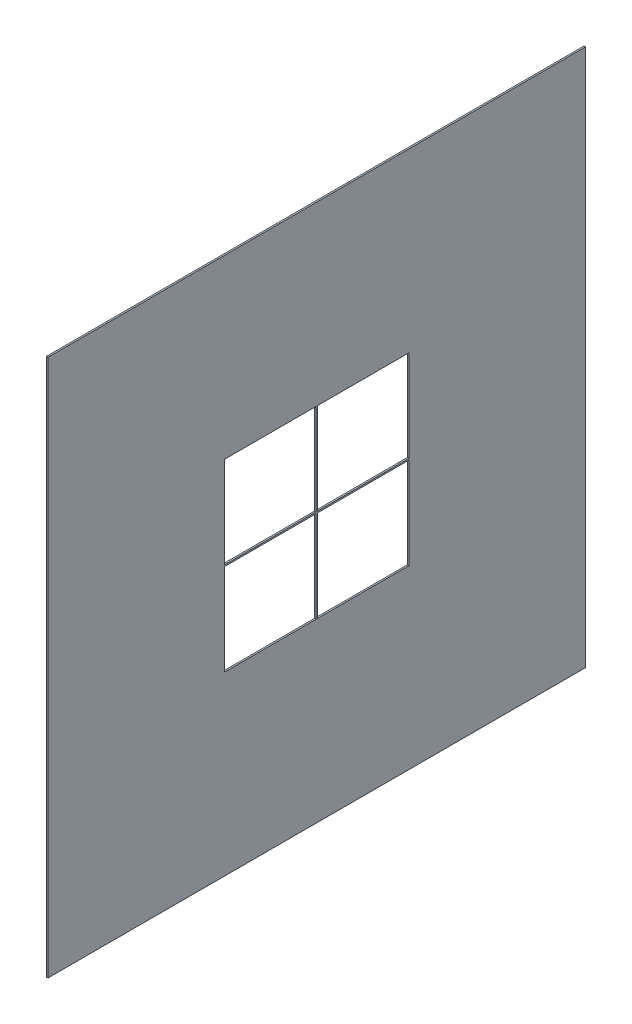
ISO-10303-21;
HEADER;
FILE_DESCRIPTION(('STEP AP214'),'2;1');
FILE_NAME('part.step','',(''),(''),'','','');
FILE_SCHEMA(('AUTOMOTIVE_DESIGN { 1 0 10303 214 1 1 1 1 }'));
ENDSEC;
DATA;
#1=APPLICATION_CONTEXT('core data for automotive mechanical design processes');
#2=APPLICATION_PROTOCOL_DEFINITION('international standard','automotive_design',2000,#1);
#3=PRODUCT_CONTEXT('',#1,'mechanical');
#4=PRODUCT('Part','Part','',(#3));
#5=PRODUCT_RELATED_PRODUCT_CATEGORY('part','',(#4));
#6=PRODUCT_DEFINITION_FORMATION('','',#4);
#7=PRODUCT_DEFINITION_CONTEXT('part definition',#1,'design');
#8=PRODUCT_DEFINITION('design','',#6,#7);
#9=PRODUCT_DEFINITION_SHAPE('','',#8);
#10=(LENGTH_UNIT() NAMED_UNIT(*) SI_UNIT(.MILLI.,.METRE.));
#11=(NAMED_UNIT(*) PLANE_ANGLE_UNIT() SI_UNIT($,.RADIAN.));
#12=(NAMED_UNIT(*) SI_UNIT($,.STERADIAN.) SOLID_ANGLE_UNIT());
#13=UNCERTAINTY_MEASURE_WITH_UNIT(LENGTH_MEASURE(1.E-05),#10,'distance_accuracy_value','');
#14=(GEOMETRIC_REPRESENTATION_CONTEXT(3) GLOBAL_UNCERTAINTY_ASSIGNED_CONTEXT((#13)) GLOBAL_UNIT_ASSIGNED_CONTEXT((#10,
#11,#12)) REPRESENTATION_CONTEXT('',''));
#15=CARTESIAN_POINT('',(0.,0.,0.));
#16=DIRECTION('',(0.,0.,1.));
#17=DIRECTION('',(1.,0.,0.));
#18=AXIS2_PLACEMENT_3D('',#15,#16,#17);
#19=CARTESIAN_POINT('',(10.,-1750.,-1750.));
#20=DIRECTION('',(0.,0.,1.));
#21=DIRECTION('',(1.,0.,0.));
#22=AXIS2_PLACEMENT_3D('',#19,#20,#21);
#23=PLANE('',#22);
#24=DIRECTION('',(0.,1.,0.));
#25=VECTOR('',#24,1.);
#26=CARTESIAN_POINT('',(0.,-1750.,-1750.));
#27=LINE('',#26,#25);
#28=CARTESIAN_POINT('',(0.,-1750.,-1750.));
#29=VERTEX_POINT('',#28);
#30=CARTESIAN_POINT('',(0.,1750.,-1750.));
#31=VERTEX_POINT('',#30);
#32=EDGE_CURVE('E300',#29,#31,#27,.T.);
#33=ORIENTED_EDGE('',*,*,#32,.T.);
#34=DIRECTION('',(-1.,0.,0.));
#35=VECTOR('',#34,1.);
#36=CARTESIAN_POINT('',(10.,1750.,-1750.));
#37=LINE('',#36,#35);
#38=CARTESIAN_POINT('',(10.,1750.,-1750.));
#39=VERTEX_POINT('',#38);
#40=EDGE_CURVE('E11',#39,#31,#37,.T.);
#41=ORIENTED_EDGE('',*,*,#40,.F.);
#42=DIRECTION('',(0.,1.,0.));
#43=VECTOR('',#42,1.);
#44=CARTESIAN_POINT('',(10.,-1750.,-1750.));
#45=LINE('',#44,#43);
#46=CARTESIAN_POINT('',(10.,-1750.,-1750.));
#47=VERTEX_POINT('',#46);
#48=EDGE_CURVE('E307',#47,#39,#45,.T.);
#49=ORIENTED_EDGE('',*,*,#48,.F.);
#50=DIRECTION('',(-1.,0.,0.));
#51=VECTOR('',#50,1.);
#52=CARTESIAN_POINT('',(10.,-1750.,-1750.));
#53=LINE('',#52,#51);
#54=EDGE_CURVE('E317',#47,#29,#53,.T.);
#55=ORIENTED_EDGE('',*,*,#54,.T.);
#56=EDGE_LOOP('',(#33,#41,#49,#55));
#57=FACE_BOUND('',#56,.T.);
#58=ADVANCED_FACE('F35',(#57),#23,.F.);
#59=CARTESIAN_POINT('',(10.,1750.,1750.));
#60=DIRECTION('',(0.,-1.,0.));
#61=DIRECTION('',(0.,0.,-1.));
#62=AXIS2_PLACEMENT_3D('',#59,#60,#61);
#63=PLANE('',#62);
#64=DIRECTION('',(0.,0.,1.));
#65=VECTOR('',#64,1.);
#66=CARTESIAN_POINT('',(0.,1750.,1750.));
#67=LINE('',#66,#65);
#68=CARTESIAN_POINT('',(0.,1750.,1750.));
#69=VERTEX_POINT('',#68);
#70=EDGE_CURVE('E320',#31,#69,#67,.T.);
#71=ORIENTED_EDGE('',*,*,#70,.T.);
#72=DIRECTION('',(-1.,0.,0.));
#73=VECTOR('',#72,1.);
#74=CARTESIAN_POINT('',(10.,1750.,1750.));
#75=LINE('',#74,#73);
#76=CARTESIAN_POINT('',(10.,1750.,1750.));
#77=VERTEX_POINT('',#76);
#78=EDGE_CURVE('E42',#77,#69,#75,.T.);
#79=ORIENTED_EDGE('',*,*,#78,.F.);
#80=DIRECTION('',(0.,0.,1.));
#81=VECTOR('',#80,1.);
#82=CARTESIAN_POINT('',(10.,1750.,1750.));
#83=LINE('',#82,#81);
#84=EDGE_CURVE('E310',#39,#77,#83,.T.);
#85=ORIENTED_EDGE('',*,*,#84,.F.);
#86=ORIENTED_EDGE('',*,*,#40,.T.);
#87=EDGE_LOOP('',(#71,#79,#85,#86));
#88=FACE_BOUND('',#87,.T.);
#89=ADVANCED_FACE('F349',(#88),#63,.F.);
#90=CARTESIAN_POINT('',(10.,-1750.,1750.));
#91=DIRECTION('',(0.,0.,-1.));
#92=DIRECTION('',(-1.,0.,0.));
#93=AXIS2_PLACEMENT_3D('',#90,#91,#92);
#94=PLANE('',#93);
#95=DIRECTION('',(0.,-1.,0.));
#96=VECTOR('',#95,1.);
#97=CARTESIAN_POINT('',(0.,-1750.,1750.));
#98=LINE('',#97,#96);
#99=CARTESIAN_POINT('',(0.,-1750.,1750.));
#100=VERTEX_POINT('',#99);
#101=EDGE_CURVE('E322',#69,#100,#98,.T.);
#102=ORIENTED_EDGE('',*,*,#101,.T.);
#103=DIRECTION('',(-1.,0.,0.));
#104=VECTOR('',#103,1.);
#105=CARTESIAN_POINT('',(10.,-1750.,1750.));
#106=LINE('',#105,#104);
#107=CARTESIAN_POINT('',(10.,-1750.,1750.));
#108=VERTEX_POINT('',#107);
#109=EDGE_CURVE('E327',#108,#100,#106,.T.);
#110=ORIENTED_EDGE('',*,*,#109,.F.);
#111=DIRECTION('',(0.,-1.,0.));
#112=VECTOR('',#111,1.);
#113=CARTESIAN_POINT('',(10.,-1750.,1750.));
#114=LINE('',#113,#112);
#115=EDGE_CURVE('E313',#77,#108,#114,.T.);
#116=ORIENTED_EDGE('',*,*,#115,.F.);
#117=ORIENTED_EDGE('',*,*,#78,.T.);
#118=EDGE_LOOP('',(#102,#110,#116,#117));
#119=FACE_BOUND('',#118,.T.);
#120=ADVANCED_FACE('F334',(#119),#94,.F.);
#121=CARTESIAN_POINT('',(10.,-1750.,1750.));
#122=DIRECTION('',(0.,1.,0.));
#123=DIRECTION('',(0.,0.,1.));
#124=AXIS2_PLACEMENT_3D('',#121,#122,#123);
#125=PLANE('',#124);
#126=DIRECTION('',(0.,0.,-1.));
#127=VECTOR('',#126,1.);
#128=CARTESIAN_POINT('',(0.,-1750.,1750.));
#129=LINE('',#128,#127);
#130=EDGE_CURVE('E311',#100,#29,#129,.T.);
#131=ORIENTED_EDGE('',*,*,#130,.T.);
#132=ORIENTED_EDGE('',*,*,#54,.F.);
#133=DIRECTION('',(0.,0.,-1.));
#134=VECTOR('',#133,1.);
#135=CARTESIAN_POINT('',(10.,-1750.,1750.));
#136=LINE('',#135,#134);
#137=EDGE_CURVE('E315',#108,#47,#136,.T.);
#138=ORIENTED_EDGE('',*,*,#137,.F.);
#139=ORIENTED_EDGE('',*,*,#109,.T.);
#140=EDGE_LOOP('',(#131,#132,#138,#139));
#141=FACE_BOUND('',#140,.T.);
#142=ADVANCED_FACE('F342',(#141),#125,.F.);
#143=CARTESIAN_POINT('',(10.,0.,0.));
#144=DIRECTION('',(-1.,0.,0.));
#145=DIRECTION('',(0.,0.,1.));
#146=AXIS2_PLACEMENT_3D('',#143,#144,#145);
#147=PLANE('',#146);
#148=DIRECTION('',(0.,1.,0.));
#149=VECTOR('',#148,1.);
#150=CARTESIAN_POINT('',(10.,-600.,-600.));
#151=LINE('',#150,#149);
#152=CARTESIAN_POINT('',(10.,-600.,-600.));
#153=VERTEX_POINT('',#152);
#154=CARTESIAN_POINT('',(10.,-4.99999999999999,-600.000000000001));
#155=VERTEX_POINT('',#154);
#156=EDGE_CURVE('E261',#153,#155,#151,.T.);
#157=ORIENTED_EDGE('',*,*,#156,.F.);
#158=DIRECTION('',(0.,0.,-1.));
#159=VECTOR('',#158,1.);
#160=CARTESIAN_POINT('',(10.,-600.,-5.00000000000014));
#161=LINE('',#160,#159);
#162=CARTESIAN_POINT('',(10.,-600.,-5.00000000000014));
#163=VERTEX_POINT('',#162);
#164=EDGE_CURVE('E49',#163,#153,#161,.T.);
#165=ORIENTED_EDGE('',*,*,#164,.F.);
#166=DIRECTION('',(0.,-1.,0.));
#167=VECTOR('',#166,1.);
#168=CARTESIAN_POINT('',(10.,-4.99999999999977,-5.00000000000006));
#169=LINE('',#168,#167);
#170=CARTESIAN_POINT('',(10.,-4.99999999999977,-5.00000000000006));
#171=VERTEX_POINT('',#170);
#172=EDGE_CURVE('E250',#171,#163,#169,.T.);
#173=ORIENTED_EDGE('',*,*,#172,.F.);
#174=DIRECTION('',(0.,0.,1.));
#175=VECTOR('',#174,1.);
#176=CARTESIAN_POINT('',(10.,-4.99999999999977,-5.00000000000006));
#177=LINE('',#176,#175);
#178=EDGE_CURVE('E264',#155,#171,#177,.T.);
#179=ORIENTED_EDGE('',*,*,#178,.F.);
#180=EDGE_LOOP('',(#157,#165,#173,#179));
#181=FACE_BOUND('',#180,.T.);
#182=DIRECTION('',(0.,0.,-1.));
#183=VECTOR('',#182,1.);
#184=CARTESIAN_POINT('',(10.,5.00000000000001,599.999999999999));
#185=LINE('',#184,#183);
#186=CARTESIAN_POINT('',(10.,5.00000000000001,599.999999999999));
#187=VERTEX_POINT('',#186);
#188=CARTESIAN_POINT('',(10.,5.00000000000024,5.));
#189=VERTEX_POINT('',#188);
#190=EDGE_CURVE('E231',#187,#189,#185,.T.);
#191=ORIENTED_EDGE('',*,*,#190,.F.);
#192=DIRECTION('',(0.,-1.,0.));
#193=VECTOR('',#192,1.);
#194=CARTESIAN_POINT('',(10.,5.00000000000001,599.999999999999));
#195=LINE('',#194,#193);
#196=CARTESIAN_POINT('',(10.,600.,600.));
#197=VERTEX_POINT('',#196);
#198=EDGE_CURVE('E57',#197,#187,#195,.T.);
#199=ORIENTED_EDGE('',*,*,#198,.F.);
#200=DIRECTION('',(0.,0.,1.));
#201=VECTOR('',#200,1.);
#202=CARTESIAN_POINT('',(10.,600.,600.));
#203=LINE('',#202,#201);
#204=CARTESIAN_POINT('',(10.,600.,4.99999999997974));
#205=VERTEX_POINT('',#204);
#206=EDGE_CURVE('E220',#205,#197,#203,.T.);
#207=ORIENTED_EDGE('',*,*,#206,.F.);
#208=DIRECTION('',(0.,1.,0.));
#209=VECTOR('',#208,1.);
#210=CARTESIAN_POINT('',(10.,600.,4.99999999997974));
#211=LINE('',#210,#209);
#212=EDGE_CURVE('E235',#189,#205,#211,.T.);
#213=ORIENTED_EDGE('',*,*,#212,.F.);
#214=EDGE_LOOP('',(#191,#199,#207,#213));
#215=FACE_BOUND('',#214,.T.);
#216=DIRECTION('',(0.,0.,-1.));
#217=VECTOR('',#216,1.);
#218=CARTESIAN_POINT('',(10.,-600.,600.));
#219=LINE('',#218,#217);
#220=CARTESIAN_POINT('',(10.,-600.,600.));
#221=VERTEX_POINT('',#220);
#222=CARTESIAN_POINT('',(10.,-600.,5.00000000001971));
#223=VERTEX_POINT('',#222);
#224=EDGE_CURVE('E205',#221,#223,#219,.T.);
#225=ORIENTED_EDGE('',*,*,#224,.F.);
#226=DIRECTION('',(0.,-1.,0.));
#227=VECTOR('',#226,1.);
#228=CARTESIAN_POINT('',(10.,-600.,600.));
#229=LINE('',#228,#227);
#230=CARTESIAN_POINT('',(10.,-4.99999999999999,599.999999999999));
#231=VERTEX_POINT('',#230);
#232=EDGE_CURVE('E178',#231,#221,#229,.T.);
#233=ORIENTED_EDGE('',*,*,#232,.F.);
#234=DIRECTION('',(0.,0.,1.));
#235=VECTOR('',#234,1.);
#236=CARTESIAN_POINT('',(10.,-4.99999999999999,599.999999999999));
#237=LINE('',#236,#235);
#238=CARTESIAN_POINT('',(10.,-4.99999999999977,4.99999999999966));
#239=VERTEX_POINT('',#238);
#240=EDGE_CURVE('E196',#239,#231,#237,.T.);
#241=ORIENTED_EDGE('',*,*,#240,.F.);
#242=DIRECTION('',(0.,1.,0.));
#243=VECTOR('',#242,1.);
#244=CARTESIAN_POINT('',(10.,-4.99999999999977,4.99999999999966));
#245=LINE('',#244,#243);
#246=EDGE_CURVE('E199',#223,#239,#245,.T.);
#247=ORIENTED_EDGE('',*,*,#246,.F.);
#248=EDGE_LOOP('',(#225,#233,#241,#247));
#249=FACE_BOUND('',#248,.T.);
#250=DIRECTION('',(0.,0.,1.));
#251=VECTOR('',#250,1.);
#252=CARTESIAN_POINT('',(10.,600.,-4.99999999999999));
#253=LINE('',#252,#251);
#254=CARTESIAN_POINT('',(10.,600.,-600.));
#255=VERTEX_POINT('',#254);
#256=CARTESIAN_POINT('',(10.,600.,-4.99999999999999));
#257=VERTEX_POINT('',#256);
#258=EDGE_CURVE('E290',#255,#257,#253,.T.);
#259=ORIENTED_EDGE('',*,*,#258,.F.);
#260=DIRECTION('',(0.,1.,0.));
#261=VECTOR('',#260,1.);
#262=CARTESIAN_POINT('',(10.,5.00000000000001,-600.000000000001));
#263=LINE('',#262,#261);
#264=CARTESIAN_POINT('',(10.,5.00000000000001,-600.000000000001));
#265=VERTEX_POINT('',#264);
#266=EDGE_CURVE('E212',#265,#255,#263,.T.);
#267=ORIENTED_EDGE('',*,*,#266,.F.);
#268=DIRECTION('',(0.,0.,-1.));
#269=VECTOR('',#268,1.);
#270=CARTESIAN_POINT('',(10.,5.00000000000023,-5.00000000000006));
#271=LINE('',#270,#269);
#272=CARTESIAN_POINT('',(10.,5.00000000000023,-5.00000000000006));
#273=VERTEX_POINT('',#272);
#274=EDGE_CURVE('E279',#273,#265,#271,.T.);
#275=ORIENTED_EDGE('',*,*,#274,.F.);
#276=DIRECTION('',(0.,-1.,0.));
#277=VECTOR('',#276,1.);
#278=CARTESIAN_POINT('',(10.,600.,-4.99999999999999));
#279=LINE('',#278,#277);
#280=EDGE_CURVE('E293',#257,#273,#279,.T.);
#281=ORIENTED_EDGE('',*,*,#280,.F.);
#282=EDGE_LOOP('',(#259,#267,#275,#281));
#283=FACE_BOUND('',#282,.T.);
#284=ORIENTED_EDGE('',*,*,#48,.T.);
#285=ORIENTED_EDGE('',*,*,#84,.T.);
#286=ORIENTED_EDGE('',*,*,#115,.T.);
#287=ORIENTED_EDGE('',*,*,#137,.T.);
#288=EDGE_LOOP('',(#284,#285,#286,#287));
#289=FACE_BOUND('',#288,.T.);
#290=ADVANCED_FACE('F348',(#181,#215,#249,#283,#289),#147,.F.);
#291=CARTESIAN_POINT('',(0.,0.,0.));
#292=DIRECTION('',(-1.,0.,0.));
#293=DIRECTION('',(0.,0.,1.));
#294=AXIS2_PLACEMENT_3D('',#291,#292,#293);
#295=PLANE('',#294);
#296=DIRECTION('',(0.,0.,-1.));
#297=VECTOR('',#296,1.);
#298=CARTESIAN_POINT('',(0.,-600.,-5.00000000000014));
#299=LINE('',#298,#297);
#300=CARTESIAN_POINT('',(0.,-600.,-5.00000000000014));
#301=VERTEX_POINT('',#300);
#302=CARTESIAN_POINT('',(0.,-600.,-600.));
#303=VERTEX_POINT('',#302);
#304=EDGE_CURVE('E246',#301,#303,#299,.T.);
#305=ORIENTED_EDGE('',*,*,#304,.T.);
#306=DIRECTION('',(0.,1.,0.));
#307=VECTOR('',#306,1.);
#308=CARTESIAN_POINT('',(0.,-600.,-600.));
#309=LINE('',#308,#307);
#310=CARTESIAN_POINT('',(0.,-4.99999999999999,-600.000000000001));
#311=VERTEX_POINT('',#310);
#312=EDGE_CURVE('E249',#303,#311,#309,.T.);
#313=ORIENTED_EDGE('',*,*,#312,.T.);
#314=DIRECTION('',(0.,0.,1.));
#315=VECTOR('',#314,1.);
#316=CARTESIAN_POINT('',(0.,-4.99999999999977,-5.00000000000006));
#317=LINE('',#316,#315);
#318=CARTESIAN_POINT('',(0.,-4.99999999999977,-5.00000000000006));
#319=VERTEX_POINT('',#318);
#320=EDGE_CURVE('E253',#311,#319,#317,.T.);
#321=ORIENTED_EDGE('',*,*,#320,.T.);
#322=DIRECTION('',(0.,-1.,0.));
#323=VECTOR('',#322,1.);
#324=CARTESIAN_POINT('',(0.,-4.99999999999977,-5.00000000000006));
#325=LINE('',#324,#323);
#326=EDGE_CURVE('E256',#319,#301,#325,.T.);
#327=ORIENTED_EDGE('',*,*,#326,.T.);
#328=EDGE_LOOP('',(#305,#313,#321,#327));
#329=FACE_BOUND('',#328,.T.);
#330=DIRECTION('',(0.,-1.,0.));
#331=VECTOR('',#330,1.);
#332=CARTESIAN_POINT('',(0.,5.00000000000001,599.999999999999));
#333=LINE('',#332,#331);
#334=CARTESIAN_POINT('',(0.,600.,600.));
#335=VERTEX_POINT('',#334);
#336=CARTESIAN_POINT('',(0.,5.00000000000001,599.999999999999));
#337=VERTEX_POINT('',#336);
#338=EDGE_CURVE('E216',#335,#337,#333,.T.);
#339=ORIENTED_EDGE('',*,*,#338,.T.);
#340=DIRECTION('',(0.,0.,-1.));
#341=VECTOR('',#340,1.);
#342=CARTESIAN_POINT('',(0.,5.00000000000001,599.999999999999));
#343=LINE('',#342,#341);
#344=CARTESIAN_POINT('',(0.,5.00000000000024,5.));
#345=VERTEX_POINT('',#344);
#346=EDGE_CURVE('E219',#337,#345,#343,.T.);
#347=ORIENTED_EDGE('',*,*,#346,.T.);
#348=DIRECTION('',(0.,1.,0.));
#349=VECTOR('',#348,1.);
#350=CARTESIAN_POINT('',(0.,600.,4.99999999997974));
#351=LINE('',#350,#349);
#352=CARTESIAN_POINT('',(0.,600.,4.99999999997974));
#353=VERTEX_POINT('',#352);
#354=EDGE_CURVE('E223',#345,#353,#351,.T.);
#355=ORIENTED_EDGE('',*,*,#354,.T.);
#356=DIRECTION('',(0.,0.,1.));
#357=VECTOR('',#356,1.);
#358=CARTESIAN_POINT('',(0.,600.,600.));
#359=LINE('',#358,#357);
#360=EDGE_CURVE('E226',#353,#335,#359,.T.);
#361=ORIENTED_EDGE('',*,*,#360,.T.);
#362=EDGE_LOOP('',(#339,#347,#355,#361));
#363=FACE_BOUND('',#362,.T.);
#364=DIRECTION('',(0.,-1.,0.));
#365=VECTOR('',#364,1.);
#366=CARTESIAN_POINT('',(0.,-600.,600.));
#367=LINE('',#366,#365);
#368=CARTESIAN_POINT('',(0.,-4.99999999999999,599.999999999999));
#369=VERTEX_POINT('',#368);
#370=CARTESIAN_POINT('',(0.,-600.,600.));
#371=VERTEX_POINT('',#370);
#372=EDGE_CURVE('E175',#369,#371,#367,.T.);
#373=ORIENTED_EDGE('',*,*,#372,.T.);
#374=DIRECTION('',(0.,0.,-1.));
#375=VECTOR('',#374,1.);
#376=CARTESIAN_POINT('',(0.,-600.,600.));
#377=LINE('',#376,#375);
#378=CARTESIAN_POINT('',(0.,-600.,5.00000000001971));
#379=VERTEX_POINT('',#378);
#380=EDGE_CURVE('E187',#371,#379,#377,.T.);
#381=ORIENTED_EDGE('',*,*,#380,.T.);
#382=DIRECTION('',(0.,1.,0.));
#383=VECTOR('',#382,1.);
#384=CARTESIAN_POINT('',(0.,-4.99999999999977,4.99999999999966));
#385=LINE('',#384,#383);
#386=CARTESIAN_POINT('',(0.,-4.99999999999977,4.99999999999966));
#387=VERTEX_POINT('',#386);
#388=EDGE_CURVE('E191',#379,#387,#385,.T.);
#389=ORIENTED_EDGE('',*,*,#388,.T.);
#390=DIRECTION('',(0.,0.,1.));
#391=VECTOR('',#390,1.);
#392=CARTESIAN_POINT('',(0.,-4.99999999999999,599.999999999999));
#393=LINE('',#392,#391);
#394=EDGE_CURVE('E183',#387,#369,#393,.T.);
#395=ORIENTED_EDGE('',*,*,#394,.T.);
#396=EDGE_LOOP('',(#373,#381,#389,#395));
#397=FACE_BOUND('',#396,.T.);
#398=DIRECTION('',(0.,1.,0.));
#399=VECTOR('',#398,1.);
#400=CARTESIAN_POINT('',(0.,5.00000000000001,-600.000000000001));
#401=LINE('',#400,#399);
#402=CARTESIAN_POINT('',(0.,5.00000000000001,-600.000000000001));
#403=VERTEX_POINT('',#402);
#404=CARTESIAN_POINT('',(0.,600.,-600.));
#405=VERTEX_POINT('',#404);
#406=EDGE_CURVE('E275',#403,#405,#401,.T.);
#407=ORIENTED_EDGE('',*,*,#406,.T.);
#408=DIRECTION('',(0.,0.,1.));
#409=VECTOR('',#408,1.);
#410=CARTESIAN_POINT('',(0.,600.,-4.99999999999999));
#411=LINE('',#410,#409);
#412=CARTESIAN_POINT('',(0.,600.,-4.99999999999999));
#413=VERTEX_POINT('',#412);
#414=EDGE_CURVE('E278',#405,#413,#411,.T.);
#415=ORIENTED_EDGE('',*,*,#414,.T.);
#416=DIRECTION('',(0.,-1.,0.));
#417=VECTOR('',#416,1.);
#418=CARTESIAN_POINT('',(0.,600.,-4.99999999999999));
#419=LINE('',#418,#417);
#420=CARTESIAN_POINT('',(0.,5.00000000000023,-5.00000000000006));
#421=VERTEX_POINT('',#420);
#422=EDGE_CURVE('E282',#413,#421,#419,.T.);
#423=ORIENTED_EDGE('',*,*,#422,.T.);
#424=DIRECTION('',(0.,0.,-1.));
#425=VECTOR('',#424,1.);
#426=CARTESIAN_POINT('',(0.,5.00000000000023,-5.00000000000006));
#427=LINE('',#426,#425);
#428=EDGE_CURVE('E285',#421,#403,#427,.T.);
#429=ORIENTED_EDGE('',*,*,#428,.T.);
#430=EDGE_LOOP('',(#407,#415,#423,#429));
#431=FACE_BOUND('',#430,.T.);
#432=ORIENTED_EDGE('',*,*,#32,.F.);
#433=ORIENTED_EDGE('',*,*,#130,.F.);
#434=ORIENTED_EDGE('',*,*,#101,.F.);
#435=ORIENTED_EDGE('',*,*,#70,.F.);
#436=EDGE_LOOP('',(#432,#433,#434,#435));
#437=FACE_BOUND('',#436,.T.);
#438=ADVANCED_FACE('F193',(#329,#363,#397,#431,#437),#295,.T.);
#439=CARTESIAN_POINT('',(0.,5.00000000000001,-600.000000000001));
#440=DIRECTION('',(0.,0.,-1.));
#441=DIRECTION('',(0.,1.,0.));
#442=AXIS2_PLACEMENT_3D('',#439,#440,#441);
#443=PLANE('',#442);
#444=ORIENTED_EDGE('',*,*,#266,.T.);
#445=DIRECTION('',(1.,0.,0.));
#446=VECTOR('',#445,1.);
#447=CARTESIAN_POINT('',(0.,600.,-600.));
#448=LINE('',#447,#446);
#449=EDGE_CURVE('E288',#405,#255,#448,.T.);
#450=ORIENTED_EDGE('',*,*,#449,.F.);
#451=ORIENTED_EDGE('',*,*,#406,.F.);
#452=DIRECTION('',(1.,0.,0.));
#453=VECTOR('',#452,1.);
#454=CARTESIAN_POINT('',(0.,5.00000000000001,-600.000000000001));
#455=LINE('',#454,#453);
#456=EDGE_CURVE('E298',#403,#265,#455,.T.);
#457=ORIENTED_EDGE('',*,*,#456,.T.);
#458=EDGE_LOOP('',(#444,#450,#451,#457));
#459=FACE_BOUND('',#458,.T.);
#460=ADVANCED_FACE('F361',(#459),#443,.F.);
#461=CARTESIAN_POINT('',(0.,5.00000000000023,-5.00000000000006));
#462=DIRECTION('',(0.,-1.,0.));
#463=DIRECTION('',(0.,0.,-1.));
#464=AXIS2_PLACEMENT_3D('',#461,#462,#463);
#465=PLANE('',#464);
#466=ORIENTED_EDGE('',*,*,#274,.T.);
#467=ORIENTED_EDGE('',*,*,#456,.F.);
#468=ORIENTED_EDGE('',*,*,#428,.F.);
#469=DIRECTION('',(1.,0.,0.));
#470=VECTOR('',#469,1.);
#471=CARTESIAN_POINT('',(0.,5.00000000000023,-5.00000000000006));
#472=LINE('',#471,#470);
#473=EDGE_CURVE('E301',#421,#273,#472,.T.);
#474=ORIENTED_EDGE('',*,*,#473,.T.);
#475=EDGE_LOOP('',(#466,#467,#468,#474));
#476=FACE_BOUND('',#475,.T.);
#477=ADVANCED_FACE('F368',(#476),#465,.F.);
#478=CARTESIAN_POINT('',(0.,600.,-4.99999999999999));
#479=DIRECTION('',(0.,0.,1.));
#480=DIRECTION('',(0.,-1.,0.));
#481=AXIS2_PLACEMENT_3D('',#478,#479,#480);
#482=PLANE('',#481);
#483=ORIENTED_EDGE('',*,*,#280,.T.);
#484=ORIENTED_EDGE('',*,*,#473,.F.);
#485=ORIENTED_EDGE('',*,*,#422,.F.);
#486=DIRECTION('',(1.,0.,0.));
#487=VECTOR('',#486,1.);
#488=CARTESIAN_POINT('',(0.,600.,-4.99999999999999));
#489=LINE('',#488,#487);
#490=EDGE_CURVE('E303',#413,#257,#489,.T.);
#491=ORIENTED_EDGE('',*,*,#490,.T.);
#492=EDGE_LOOP('',(#483,#484,#485,#491));
#493=FACE_BOUND('',#492,.T.);
#494=ADVANCED_FACE('F373',(#493),#482,.F.);
#495=CARTESIAN_POINT('',(0.,600.,-4.99999999999999));
#496=DIRECTION('',(0.,1.,0.));
#497=DIRECTION('',(0.,0.,1.));
#498=AXIS2_PLACEMENT_3D('',#495,#496,#497);
#499=PLANE('',#498);
#500=ORIENTED_EDGE('',*,*,#258,.T.);
#501=ORIENTED_EDGE('',*,*,#490,.F.);
#502=ORIENTED_EDGE('',*,*,#414,.F.);
#503=ORIENTED_EDGE('',*,*,#449,.T.);
#504=EDGE_LOOP('',(#500,#501,#502,#503));
#505=FACE_BOUND('',#504,.T.);
#506=ADVANCED_FACE('F370',(#505),#499,.F.);
#507=CARTESIAN_POINT('',(0.,-600.,600.));
#508=DIRECTION('',(0.,0.,1.));
#509=DIRECTION('',(0.,-1.,0.));
#510=AXIS2_PLACEMENT_3D('',#507,#508,#509);
#511=PLANE('',#510);
#512=ORIENTED_EDGE('',*,*,#232,.T.);
#513=DIRECTION('',(1.,0.,0.));
#514=VECTOR('',#513,1.);
#515=CARTESIAN_POINT('',(0.,-600.,600.));
#516=LINE('',#515,#514);
#517=EDGE_CURVE('E171',#371,#221,#516,.T.);
#518=ORIENTED_EDGE('',*,*,#517,.F.);
#519=ORIENTED_EDGE('',*,*,#372,.F.);
#520=DIRECTION('',(1.,0.,0.));
#521=VECTOR('',#520,1.);
#522=CARTESIAN_POINT('',(0.,-4.99999999999999,599.999999999999));
#523=LINE('',#522,#521);
#524=EDGE_CURVE('E210',#369,#231,#523,.T.);
#525=ORIENTED_EDGE('',*,*,#524,.T.);
#526=EDGE_LOOP('',(#512,#518,#519,#525));
#527=FACE_BOUND('',#526,.T.);
#528=ADVANCED_FACE('F173',(#527),#511,.F.);
#529=CARTESIAN_POINT('',(0.,-4.99999999999999,599.999999999999));
#530=DIRECTION('',(0.,1.,0.));
#531=DIRECTION('',(0.,0.,1.));
#532=AXIS2_PLACEMENT_3D('',#529,#530,#531);
#533=PLANE('',#532);
#534=ORIENTED_EDGE('',*,*,#240,.T.);
#535=ORIENTED_EDGE('',*,*,#524,.F.);
#536=ORIENTED_EDGE('',*,*,#394,.F.);
#537=DIRECTION('',(1.,0.,0.));
#538=VECTOR('',#537,1.);
#539=CARTESIAN_POINT('',(0.,-4.99999999999977,4.99999999999966));
#540=LINE('',#539,#538);
#541=EDGE_CURVE('E213',#387,#239,#540,.T.);
#542=ORIENTED_EDGE('',*,*,#541,.T.);
#543=EDGE_LOOP('',(#534,#535,#536,#542));
#544=FACE_BOUND('',#543,.T.);
#545=ADVANCED_FACE('F413',(#544),#533,.F.);
#546=CARTESIAN_POINT('',(0.,-4.99999999999977,4.99999999999966));
#547=DIRECTION('',(0.,0.,-1.));
#548=DIRECTION('',(0.,1.,0.));
#549=AXIS2_PLACEMENT_3D('',#546,#547,#548);
#550=PLANE('',#549);
#551=ORIENTED_EDGE('',*,*,#246,.T.);
#552=ORIENTED_EDGE('',*,*,#541,.F.);
#553=ORIENTED_EDGE('',*,*,#388,.F.);
#554=DIRECTION('',(1.,0.,0.));
#555=VECTOR('',#554,1.);
#556=CARTESIAN_POINT('',(0.,-600.,5.00000000001971));
#557=LINE('',#556,#555);
#558=EDGE_CURVE('E182',#379,#223,#557,.T.);
#559=ORIENTED_EDGE('',*,*,#558,.T.);
#560=EDGE_LOOP('',(#551,#552,#553,#559));
#561=FACE_BOUND('',#560,.T.);
#562=ADVANCED_FACE('F416',(#561),#550,.F.);
#563=CARTESIAN_POINT('',(0.,-600.,600.));
#564=DIRECTION('',(0.,-1.,0.));
#565=DIRECTION('',(0.,0.,-1.));
#566=AXIS2_PLACEMENT_3D('',#563,#564,#565);
#567=PLANE('',#566);
#568=ORIENTED_EDGE('',*,*,#224,.T.);
#569=ORIENTED_EDGE('',*,*,#558,.F.);
#570=ORIENTED_EDGE('',*,*,#380,.F.);
#571=ORIENTED_EDGE('',*,*,#517,.T.);
#572=EDGE_LOOP('',(#568,#569,#570,#571));
#573=FACE_BOUND('',#572,.T.);
#574=ADVANCED_FACE('F188',(#573),#567,.F.);
#575=CARTESIAN_POINT('',(0.,5.00000000000001,599.999999999999));
#576=DIRECTION('',(0.,0.,1.));
#577=DIRECTION('',(0.,-1.,0.));
#578=AXIS2_PLACEMENT_3D('',#575,#576,#577);
#579=PLANE('',#578);
#580=ORIENTED_EDGE('',*,*,#198,.T.);
#581=DIRECTION('',(1.,0.,0.));
#582=VECTOR('',#581,1.);
#583=CARTESIAN_POINT('',(0.,5.00000000000001,599.999999999999));
#584=LINE('',#583,#582);
#585=EDGE_CURVE('E229',#337,#187,#584,.T.);
#586=ORIENTED_EDGE('',*,*,#585,.F.);
#587=ORIENTED_EDGE('',*,*,#338,.F.);
#588=DIRECTION('',(1.,0.,0.));
#589=VECTOR('',#588,1.);
#590=CARTESIAN_POINT('',(0.,600.,600.));
#591=LINE('',#590,#589);
#592=EDGE_CURVE('E206',#335,#197,#591,.T.);
#593=ORIENTED_EDGE('',*,*,#592,.T.);
#594=EDGE_LOOP('',(#580,#586,#587,#593));
#595=FACE_BOUND('',#594,.T.);
#596=ADVANCED_FACE('F397',(#595),#579,.F.);
#597=CARTESIAN_POINT('',(0.,600.,600.));
#598=DIRECTION('',(0.,1.,0.));
#599=DIRECTION('',(0.,0.,1.));
#600=AXIS2_PLACEMENT_3D('',#597,#598,#599);
#601=PLANE('',#600);
#602=ORIENTED_EDGE('',*,*,#206,.T.);
#603=ORIENTED_EDGE('',*,*,#592,.F.);
#604=ORIENTED_EDGE('',*,*,#360,.F.);
#605=DIRECTION('',(1.,0.,0.));
#606=VECTOR('',#605,1.);
#607=CARTESIAN_POINT('',(0.,600.,4.99999999997974));
#608=LINE('',#607,#606);
#609=EDGE_CURVE('E241',#353,#205,#608,.T.);
#610=ORIENTED_EDGE('',*,*,#609,.T.);
#611=EDGE_LOOP('',(#602,#603,#604,#610));
#612=FACE_BOUND('',#611,.T.);
#613=ADVANCED_FACE('F400',(#612),#601,.F.);
#614=CARTESIAN_POINT('',(0.,600.,4.99999999997974));
#615=DIRECTION('',(0.,0.,-1.));
#616=DIRECTION('',(0.,1.,0.));
#617=AXIS2_PLACEMENT_3D('',#614,#615,#616);
#618=PLANE('',#617);
#619=ORIENTED_EDGE('',*,*,#212,.T.);
#620=ORIENTED_EDGE('',*,*,#609,.F.);
#621=ORIENTED_EDGE('',*,*,#354,.F.);
#622=DIRECTION('',(1.,0.,0.));
#623=VECTOR('',#622,1.);
#624=CARTESIAN_POINT('',(0.,5.00000000000024,5.));
#625=LINE('',#624,#623);
#626=EDGE_CURVE('E243',#345,#189,#625,.T.);
#627=ORIENTED_EDGE('',*,*,#626,.T.);
#628=EDGE_LOOP('',(#619,#620,#621,#627));
#629=FACE_BOUND('',#628,.T.);
#630=ADVANCED_FACE('F403',(#629),#618,.F.);
#631=CARTESIAN_POINT('',(0.,5.00000000000001,599.999999999999));
#632=DIRECTION('',(0.,-1.,0.));
#633=DIRECTION('',(0.,0.,-1.));
#634=AXIS2_PLACEMENT_3D('',#631,#632,#633);
#635=PLANE('',#634);
#636=ORIENTED_EDGE('',*,*,#190,.T.);
#637=ORIENTED_EDGE('',*,*,#626,.F.);
#638=ORIENTED_EDGE('',*,*,#346,.F.);
#639=ORIENTED_EDGE('',*,*,#585,.T.);
#640=EDGE_LOOP('',(#636,#637,#638,#639));
#641=FACE_BOUND('',#640,.T.);
#642=ADVANCED_FACE('F385',(#641),#635,.F.);
#643=CARTESIAN_POINT('',(0.,-600.,-5.00000000000014));
#644=DIRECTION('',(0.,-1.,0.));
#645=DIRECTION('',(0.,0.,-1.));
#646=AXIS2_PLACEMENT_3D('',#643,#644,#645);
#647=PLANE('',#646);
#648=ORIENTED_EDGE('',*,*,#164,.T.);
#649=DIRECTION('',(1.,0.,0.));
#650=VECTOR('',#649,1.);
#651=CARTESIAN_POINT('',(0.,-600.,-600.));
#652=LINE('',#651,#650);
#653=EDGE_CURVE('E259',#303,#153,#652,.T.);
#654=ORIENTED_EDGE('',*,*,#653,.F.);
#655=ORIENTED_EDGE('',*,*,#304,.F.);
#656=DIRECTION('',(1.,0.,0.));
#657=VECTOR('',#656,1.);
#658=CARTESIAN_POINT('',(0.,-600.,-5.00000000000014));
#659=LINE('',#658,#657);
#660=EDGE_CURVE('E232',#301,#163,#659,.T.);
#661=ORIENTED_EDGE('',*,*,#660,.T.);
#662=EDGE_LOOP('',(#648,#654,#655,#661));
#663=FACE_BOUND('',#662,.T.);
#664=ADVANCED_FACE('F381',(#663),#647,.F.);
#665=CARTESIAN_POINT('',(0.,-4.99999999999977,-5.00000000000006));
#666=DIRECTION('',(0.,0.,1.));
#667=DIRECTION('',(0.,-1.,0.));
#668=AXIS2_PLACEMENT_3D('',#665,#666,#667);
#669=PLANE('',#668);
#670=ORIENTED_EDGE('',*,*,#172,.T.);
#671=ORIENTED_EDGE('',*,*,#660,.F.);
#672=ORIENTED_EDGE('',*,*,#326,.F.);
#673=DIRECTION('',(1.,0.,0.));
#674=VECTOR('',#673,1.);
#675=CARTESIAN_POINT('',(0.,-4.99999999999977,-5.00000000000006));
#676=LINE('',#675,#674);
#677=EDGE_CURVE('E270',#319,#171,#676,.T.);
#678=ORIENTED_EDGE('',*,*,#677,.T.);
#679=EDGE_LOOP('',(#670,#671,#672,#678));
#680=FACE_BOUND('',#679,.T.);
#681=ADVANCED_FACE('F384',(#680),#669,.F.);
#682=CARTESIAN_POINT('',(0.,-4.99999999999977,-5.00000000000006));
#683=DIRECTION('',(0.,1.,0.));
#684=DIRECTION('',(0.,0.,1.));
#685=AXIS2_PLACEMENT_3D('',#682,#683,#684);
#686=PLANE('',#685);
#687=ORIENTED_EDGE('',*,*,#178,.T.);
#688=ORIENTED_EDGE('',*,*,#677,.F.);
#689=ORIENTED_EDGE('',*,*,#320,.F.);
#690=DIRECTION('',(1.,0.,0.));
#691=VECTOR('',#690,1.);
#692=CARTESIAN_POINT('',(0.,-4.99999999999999,-600.000000000001));
#693=LINE('',#692,#691);
#694=EDGE_CURVE('E272',#311,#155,#693,.T.);
#695=ORIENTED_EDGE('',*,*,#694,.T.);
#696=EDGE_LOOP('',(#687,#688,#689,#695));
#697=FACE_BOUND('',#696,.T.);
#698=ADVANCED_FACE('F389',(#697),#686,.F.);
#699=CARTESIAN_POINT('',(0.,-600.,-600.));
#700=DIRECTION('',(0.,0.,-1.));
#701=DIRECTION('',(0.,1.,0.));
#702=AXIS2_PLACEMENT_3D('',#699,#700,#701);
#703=PLANE('',#702);
#704=ORIENTED_EDGE('',*,*,#156,.T.);
#705=ORIENTED_EDGE('',*,*,#694,.F.);
#706=ORIENTED_EDGE('',*,*,#312,.F.);
#707=ORIENTED_EDGE('',*,*,#653,.T.);
#708=EDGE_LOOP('',(#704,#705,#706,#707));
#709=FACE_BOUND('',#708,.T.);
#710=ADVANCED_FACE('F386',(#709),#703,.F.);
#711=CLOSED_SHELL('',(#58,#89,#120,#142,#290,#438,#460,#477,#494,#506,#528,#545,#562,#574,#596,
#613,#630,#642,#664,#681,#698,#710));
#712=MANIFOLD_SOLID_BREP('B2',#711);
#713=ADVANCED_BREP_SHAPE_REPRESENTATION('',(#18,#712),#14);
#714=SHAPE_DEFINITION_REPRESENTATION(#9,#713);
ENDSEC;
END-ISO-10303-21;
